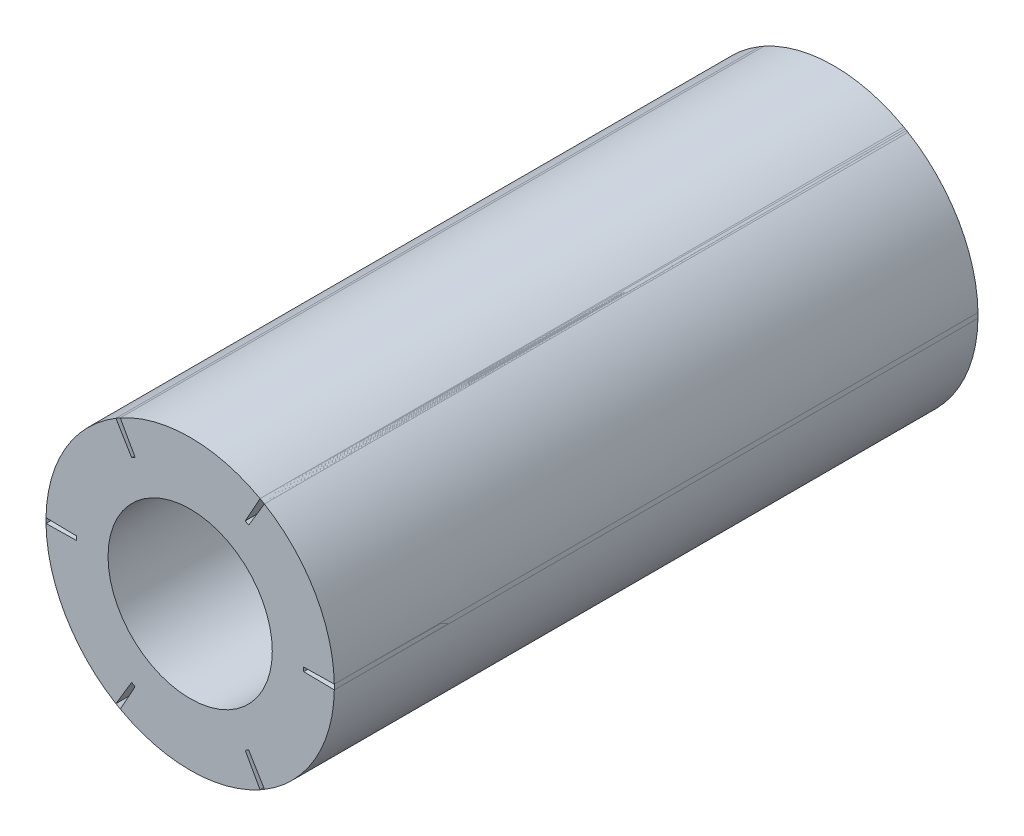
ISO-10303-21;
HEADER;
FILE_DESCRIPTION(('STEP AP214'),'2;1');
FILE_NAME('part.step','',(''),(''),'','','');
FILE_SCHEMA(('AUTOMOTIVE_DESIGN { 1 0 10303 214 1 1 1 1 }'));
ENDSEC;
DATA;
#1=APPLICATION_CONTEXT('core data for automotive mechanical design processes');
#2=APPLICATION_PROTOCOL_DEFINITION('international standard','automotive_design',2000,#1);
#3=PRODUCT_CONTEXT('',#1,'mechanical');
#4=PRODUCT('Part','Part','',(#3));
#5=PRODUCT_RELATED_PRODUCT_CATEGORY('part','',(#4));
#6=PRODUCT_DEFINITION_FORMATION('','',#4);
#7=PRODUCT_DEFINITION_CONTEXT('part definition',#1,'design');
#8=PRODUCT_DEFINITION('design','',#6,#7);
#9=PRODUCT_DEFINITION_SHAPE('','',#8);
#10=(LENGTH_UNIT() NAMED_UNIT(*) SI_UNIT(.MILLI.,.METRE.));
#11=(NAMED_UNIT(*) PLANE_ANGLE_UNIT() SI_UNIT($,.RADIAN.));
#12=(NAMED_UNIT(*) SI_UNIT($,.STERADIAN.) SOLID_ANGLE_UNIT());
#13=UNCERTAINTY_MEASURE_WITH_UNIT(LENGTH_MEASURE(1.E-05),#10,'distance_accuracy_value','');
#14=(GEOMETRIC_REPRESENTATION_CONTEXT(3) GLOBAL_UNCERTAINTY_ASSIGNED_CONTEXT((#13)) GLOBAL_UNIT_ASSIGNED_CONTEXT((#10,
#11,#12)) REPRESENTATION_CONTEXT('',''));
#15=CARTESIAN_POINT('',(0.,0.,0.));
#16=DIRECTION('',(0.,0.,1.));
#17=DIRECTION('',(1.,0.,0.));
#18=AXIS2_PLACEMENT_3D('',#15,#16,#17);
#19=CARTESIAN_POINT('',(0.,0.,25.));
#20=DIRECTION('',(0.,0.,-1.));
#21=DIRECTION('',(-1.,0.,0.));
#22=AXIS2_PLACEMENT_3D('',#19,#20,#21);
#23=CYLINDRICAL_SURFACE('',#22,5.6);
#24=DIRECTION('',(0.,0.,-1.));
#25=VECTOR('',#24,1.);
#26=CARTESIAN_POINT('',(-2.88421321949728,4.80013688393124,25.));
#27=LINE('',#26,#25);
#28=CARTESIAN_POINT('',(-2.88421321949731,4.80013688393122,0.));
#29=VERTEX_POINT('',#28);
#30=CARTESIAN_POINT('',(-2.88421321949731,4.80013688393122,25.));
#31=VERTEX_POINT('',#30);
#32=EDGE_CURVE('E292',#29,#31,#27,.F.);
#33=ORIENTED_EDGE('',*,*,#32,.F.);
#34=CARTESIAN_POINT('',(0.,0.,0.));
#35=DIRECTION('',(0.,0.,1.));
#36=DIRECTION('',(1.,0.,0.));
#37=AXIS2_PLACEMENT_3D('',#34,#35,#36);
#38=CIRCLE('',#37,5.6);
#39=CARTESIAN_POINT('',(-5.59914709287577,0.0977334760499665,0.));
#40=VERTEX_POINT('',#39);
#41=EDGE_CURVE('E239',#29,#40,#38,.T.);
#42=ORIENTED_EDGE('',*,*,#41,.T.);
#43=DIRECTION('',(0.,0.,-1.));
#44=VECTOR('',#43,1.);
#45=CARTESIAN_POINT('',(-5.59914709287577,0.0977334760499665,25.));
#46=LINE('',#45,#44);
#47=CARTESIAN_POINT('',(-5.59914709287577,0.0977334760499665,25.));
#48=VERTEX_POINT('',#47);
#49=EDGE_CURVE('E301',#40,#48,#46,.F.);
#50=ORIENTED_EDGE('',*,*,#49,.T.);
#51=CARTESIAN_POINT('',(0.,0.,25.));
#52=DIRECTION('',(0.,0.,1.));
#53=DIRECTION('',(1.,0.,0.));
#54=AXIS2_PLACEMENT_3D('',#51,#52,#53);
#55=CIRCLE('',#54,5.6);
#56=EDGE_CURVE('E232',#31,#48,#55,.T.);
#57=ORIENTED_EDGE('',*,*,#56,.F.);
#58=EDGE_LOOP('',(#33,#42,#50,#57));
#59=FACE_BOUND('',#58,.T.);
#60=ADVANCED_FACE('F46',(#59),#23,.T.);
#61=DIRECTION('',(0.,0.,-1.));
#62=VECTOR('',#61,1.);
#63=CARTESIAN_POINT('',(-5.59914709287577,-0.097733476049927,25.));
#64=LINE('',#63,#62);
#65=CARTESIAN_POINT('',(-5.59914709287577,-0.0977334760499665,0.));
#66=VERTEX_POINT('',#65);
#67=CARTESIAN_POINT('',(-5.59914709287577,-0.0977334760499665,25.));
#68=VERTEX_POINT('',#67);
#69=EDGE_CURVE('E296',#66,#68,#64,.F.);
#70=ORIENTED_EDGE('',*,*,#69,.F.);
#71=CARTESIAN_POINT('',(-2.88421321949732,-4.80013688393122,0.));
#72=VERTEX_POINT('',#71);
#73=EDGE_CURVE('E257',#66,#72,#38,.T.);
#74=ORIENTED_EDGE('',*,*,#73,.T.);
#75=DIRECTION('',(0.,0.,-1.));
#76=VECTOR('',#75,1.);
#77=CARTESIAN_POINT('',(-2.88421321949732,-4.80013688393122,25.));
#78=LINE('',#77,#76);
#79=CARTESIAN_POINT('',(-2.88421321949732,-4.80013688393122,25.));
#80=VERTEX_POINT('',#79);
#81=EDGE_CURVE('E261',#72,#80,#78,.F.);
#82=ORIENTED_EDGE('',*,*,#81,.T.);
#83=EDGE_CURVE('E268',#68,#80,#55,.T.);
#84=ORIENTED_EDGE('',*,*,#83,.F.);
#85=EDGE_LOOP('',(#70,#74,#82,#84));
#86=FACE_BOUND('',#85,.T.);
#87=ADVANCED_FACE('F557',(#86),#23,.T.);
#88=DIRECTION('',(0.,0.,-1.));
#89=VECTOR('',#88,1.);
#90=CARTESIAN_POINT('',(-2.71493387337848,-4.89787035998118,25.));
#91=LINE('',#90,#89);
#92=CARTESIAN_POINT('',(-2.71493387337846,-4.89787035998119,0.));
#93=VERTEX_POINT('',#92);
#94=CARTESIAN_POINT('',(-2.71493387337846,-4.89787035998119,25.));
#95=VERTEX_POINT('',#94);
#96=EDGE_CURVE('E311',#93,#95,#91,.F.);
#97=ORIENTED_EDGE('',*,*,#96,.F.);
#98=CARTESIAN_POINT('',(2.71493387337846,-4.89787035998119,0.));
#99=VERTEX_POINT('',#98);
#100=EDGE_CURVE('E259',#93,#99,#38,.T.);
#101=ORIENTED_EDGE('',*,*,#100,.T.);
#102=DIRECTION('',(0.,0.,-1.));
#103=VECTOR('',#102,1.);
#104=CARTESIAN_POINT('',(2.71493387337846,-4.89787035998119,25.));
#105=LINE('',#104,#103);
#106=CARTESIAN_POINT('',(2.71493387337846,-4.89787035998119,25.));
#107=VERTEX_POINT('',#106);
#108=EDGE_CURVE('E234',#99,#107,#105,.F.);
#109=ORIENTED_EDGE('',*,*,#108,.T.);
#110=EDGE_CURVE('E271',#95,#107,#55,.T.);
#111=ORIENTED_EDGE('',*,*,#110,.F.);
#112=EDGE_LOOP('',(#97,#101,#109,#111));
#113=FACE_BOUND('',#112,.T.);
#114=ADVANCED_FACE('F326',(#113),#23,.T.);
#115=DIRECTION('',(0.,0.,-1.));
#116=VECTOR('',#115,1.);
#117=CARTESIAN_POINT('',(2.88421321949738,-4.80013688393119,25.));
#118=LINE('',#117,#116);
#119=CARTESIAN_POINT('',(2.88421321949731,-4.80013688393122,0.));
#120=VERTEX_POINT('',#119);
#121=CARTESIAN_POINT('',(2.88421321949731,-4.80013688393122,25.));
#122=VERTEX_POINT('',#121);
#123=EDGE_CURVE('E147',#120,#122,#118,.F.);
#124=ORIENTED_EDGE('',*,*,#123,.F.);
#125=CARTESIAN_POINT('',(5.59914709287577,-0.0977334760499688,0.));
#126=VERTEX_POINT('',#125);
#127=EDGE_CURVE('E230',#120,#126,#38,.T.);
#128=ORIENTED_EDGE('',*,*,#127,.T.);
#129=DIRECTION('',(0.,0.,-1.));
#130=VECTOR('',#129,1.);
#131=CARTESIAN_POINT('',(5.59914709287577,-0.0977334760499688,25.));
#132=LINE('',#131,#130);
#133=CARTESIAN_POINT('',(5.59914709287577,-0.0977334760499688,25.));
#134=VERTEX_POINT('',#133);
#135=EDGE_CURVE('E459',#134,#126,#132,.T.);
#136=ORIENTED_EDGE('',*,*,#135,.F.);
#137=EDGE_CURVE('E274',#122,#134,#55,.T.);
#138=ORIENTED_EDGE('',*,*,#137,.F.);
#139=EDGE_LOOP('',(#124,#128,#136,#138));
#140=FACE_BOUND('',#139,.T.);
#141=ADVANCED_FACE('F458',(#140),#23,.T.);
#142=CARTESIAN_POINT('',(2.71493387337846,4.89787035998119,0.));
#143=VERTEX_POINT('',#142);
#144=CARTESIAN_POINT('',(-2.71493387337846,4.89787035998119,0.));
#145=VERTEX_POINT('',#144);
#146=EDGE_CURVE('E217',#143,#145,#38,.T.);
#147=ORIENTED_EDGE('',*,*,#146,.T.);
#148=DIRECTION('',(0.,0.,-1.));
#149=VECTOR('',#148,1.);
#150=CARTESIAN_POINT('',(-2.71493387337846,4.89787035998119,25.));
#151=LINE('',#150,#149);
#152=CARTESIAN_POINT('',(-2.71493387337846,4.89787035998119,25.));
#153=VERTEX_POINT('',#152);
#154=EDGE_CURVE('E229',#145,#153,#151,.F.);
#155=ORIENTED_EDGE('',*,*,#154,.T.);
#156=CARTESIAN_POINT('',(2.71493387337846,4.89787035998119,25.));
#157=VERTEX_POINT('',#156);
#158=EDGE_CURVE('E220',#157,#153,#55,.T.);
#159=ORIENTED_EDGE('',*,*,#158,.F.);
#160=DIRECTION('',(0.,0.,-1.));
#161=VECTOR('',#160,1.);
#162=CARTESIAN_POINT('',(2.71493387337834,4.89787035998125,25.));
#163=LINE('',#162,#161);
#164=EDGE_CURVE('E203',#143,#157,#163,.F.);
#165=ORIENTED_EDGE('',*,*,#164,.F.);
#166=EDGE_LOOP('',(#147,#155,#159,#165));
#167=FACE_BOUND('',#166,.T.);
#168=ADVANCED_FACE('F215',(#167),#23,.T.);
#169=CARTESIAN_POINT('',(0.,0.,25.));
#170=DIRECTION('',(0.,0.,1.));
#171=DIRECTION('',(1.,0.,0.));
#172=AXIS2_PLACEMENT_3D('',#169,#170,#171);
#173=PLANE('',#172);
#174=DIRECTION('',(0.860145247092158,0.510049168124771,0.));
#175=VECTOR('',#174,1.);
#176=CARTESIAN_POINT('',(-2.27131174979071,3.78009754319653,25.));
#177=LINE('',#176,#175);
#178=CARTESIAN_POINT('',(-2.27131174979071,3.78009754319653,25.));
#179=VERTEX_POINT('',#178);
#180=CARTESIAN_POINT('',(-2.13887386584799,3.85863059649369,25.));
#181=VERTEX_POINT('',#180);
#182=EDGE_CURVE('E56',#179,#181,#177,.T.);
#183=ORIENTED_EDGE('',*,*,#182,.F.);
#184=DIRECTION('',(0.515038074910234,-0.857167300702004,0.));
#185=VECTOR('',#184,1.);
#186=CARTESIAN_POINT('',(-2.88421321949731,4.80013688393122,25.));
#187=LINE('',#186,#185);
#188=EDGE_CURVE('E294',#31,#179,#187,.T.);
#189=ORIENTED_EDGE('',*,*,#188,.F.);
#190=ORIENTED_EDGE('',*,*,#56,.T.);
#191=DIRECTION('',(-0.999847695156387,0.0174524064374934,0.));
#192=VECTOR('',#191,1.);
#193=CARTESIAN_POINT('',(-5.59914709287577,0.0977334760499665,25.));
#194=LINE('',#193,#192);
#195=CARTESIAN_POINT('',(-4.41110905330743,0.0769961949318594,25.));
#196=VERTEX_POINT('',#195);
#197=EDGE_CURVE('E429',#196,#48,#194,.T.);
#198=ORIENTED_EDGE('',*,*,#197,.F.);
#199=DIRECTION('',(-0.0116429132290937,0.999932218988637,0.));
#200=VECTOR('',#199,1.);
#201=CARTESIAN_POINT('',(-4.40931637608669,-0.0769649036345756,25.));
#202=LINE('',#201,#200);
#203=CARTESIAN_POINT('',(-4.40931637608669,-0.0769649036345756,25.));
#204=VERTEX_POINT('',#203);
#205=EDGE_CURVE('E299',#204,#196,#202,.T.);
#206=ORIENTED_EDGE('',*,*,#205,.F.);
#207=DIRECTION('',(0.999847695156388,0.0174524064374934,0.));
#208=VECTOR('',#207,1.);
#209=CARTESIAN_POINT('',(-5.59914709287577,-0.0977334760499665,25.));
#210=LINE('',#209,#208);
#211=EDGE_CURVE('E300',#68,#204,#210,.T.);
#212=ORIENTED_EDGE('',*,*,#211,.F.);
#213=ORIENTED_EDGE('',*,*,#83,.T.);
#214=DIRECTION('',(-0.515038074910234,-0.857167300702004,0.));
#215=VECTOR('',#214,1.);
#216=CARTESIAN_POINT('',(-2.88421321949732,-4.80013688393122,25.));
#217=LINE('',#216,#215);
#218=CARTESIAN_POINT('',(-2.27223518745945,-3.78163440156183,25.));
#219=VERTEX_POINT('',#218);
#220=EDGE_CURVE('E346',#219,#80,#217,.T.);
#221=ORIENTED_EDGE('',*,*,#220,.F.);
#222=DIRECTION('',(-0.871788160321251,0.489883050863866,0.));
#223=VECTOR('',#222,1.);
#224=CARTESIAN_POINT('',(-2.13800462629598,-3.8570624468311,25.));
#225=LINE('',#224,#223);
#226=CARTESIAN_POINT('',(-2.13800462629598,-3.8570624468311,25.));
#227=VERTEX_POINT('',#226);
#228=EDGE_CURVE('E314',#227,#219,#225,.T.);
#229=ORIENTED_EDGE('',*,*,#228,.F.);
#230=DIRECTION('',(0.484809620246154,0.874619707139497,0.));
#231=VECTOR('',#230,1.);
#232=CARTESIAN_POINT('',(-2.71493387337846,-4.89787035998119,25.));
#233=LINE('',#232,#231);
#234=EDGE_CURVE('E315',#95,#227,#233,.T.);
#235=ORIENTED_EDGE('',*,*,#234,.F.);
#236=ORIENTED_EDGE('',*,*,#110,.T.);
#237=DIRECTION('',(0.484809620246153,-0.874619707139498,0.));
#238=VECTOR('',#237,1.);
#239=CARTESIAN_POINT('',(2.71493387337846,-4.89787035998119,25.));
#240=LINE('',#239,#238);
#241=CARTESIAN_POINT('',(2.13887386584799,-3.85863059649369,25.));
#242=VERTEX_POINT('',#241);
#243=EDGE_CURVE('E338',#242,#107,#240,.T.);
#244=ORIENTED_EDGE('',*,*,#243,.F.);
#245=DIRECTION('',(-0.860145247092158,-0.510049168124771,0.));
#246=VECTOR('',#245,1.);
#247=CARTESIAN_POINT('',(2.27131174979071,-3.78009754319653,25.));
#248=LINE('',#247,#246);
#249=CARTESIAN_POINT('',(2.27131174979071,-3.78009754319653,25.));
#250=VERTEX_POINT('',#249);
#251=EDGE_CURVE('E318',#250,#242,#248,.T.);
#252=ORIENTED_EDGE('',*,*,#251,.F.);
#253=DIRECTION('',(-0.515038074910234,0.857167300702004,0.));
#254=VECTOR('',#253,1.);
#255=CARTESIAN_POINT('',(2.88421321949731,-4.80013688393122,25.));
#256=LINE('',#255,#254);
#257=EDGE_CURVE('E319',#122,#250,#256,.T.);
#258=ORIENTED_EDGE('',*,*,#257,.F.);
#259=ORIENTED_EDGE('',*,*,#137,.T.);
#260=DIRECTION('',(-0.999847695156388,0.0174524064374935,0.));
#261=VECTOR('',#260,1.);
#262=CARTESIAN_POINT('',(5.59914709287577,-0.0977334760499688,25.));
#263=LINE('',#262,#261);
#264=CARTESIAN_POINT('',(4.41110905330743,-0.0769961949318616,25.));
#265=VERTEX_POINT('',#264);
#266=EDGE_CURVE('E276',#134,#265,#263,.T.);
#267=ORIENTED_EDGE('',*,*,#266,.T.);
#268=DIRECTION('',(0.0116429132290993,-0.999932218988637,0.));
#269=VECTOR('',#268,1.);
#270=CARTESIAN_POINT('',(4.40931637608669,0.0769649036345737,25.));
#271=LINE('',#270,#269);
#272=CARTESIAN_POINT('',(4.40931637608669,0.0769649036345737,25.));
#273=VERTEX_POINT('',#272);
#274=EDGE_CURVE('E466',#273,#265,#271,.T.);
#275=ORIENTED_EDGE('',*,*,#274,.F.);
#276=DIRECTION('',(-0.999847695156387,-0.0174524064374929,0.));
#277=VECTOR('',#276,1.);
#278=CARTESIAN_POINT('',(5.59914709287577,0.097733476049964,25.));
#279=LINE('',#278,#277);
#280=CARTESIAN_POINT('',(5.59914709287577,0.097733476049964,25.));
#281=VERTEX_POINT('',#280);
#282=EDGE_CURVE('E528',#281,#273,#279,.T.);
#283=ORIENTED_EDGE('',*,*,#282,.F.);
#284=CARTESIAN_POINT('',(2.88421321949732,4.80013688393122,25.));
#285=VERTEX_POINT('',#284);
#286=EDGE_CURVE('E265',#281,#285,#55,.T.);
#287=ORIENTED_EDGE('',*,*,#286,.T.);
#288=DIRECTION('',(0.515038074910234,0.857167300702004,0.));
#289=VECTOR('',#288,1.);
#290=CARTESIAN_POINT('',(2.88421321949732,4.80013688393122,25.));
#291=LINE('',#290,#289);
#292=CARTESIAN_POINT('',(2.27223518745945,3.78163440156183,25.));
#293=VERTEX_POINT('',#292);
#294=EDGE_CURVE('E369',#293,#285,#291,.T.);
#295=ORIENTED_EDGE('',*,*,#294,.F.);
#296=DIRECTION('',(0.871788160321251,-0.489883050863866,0.));
#297=VECTOR('',#296,1.);
#298=CARTESIAN_POINT('',(2.13800462629598,3.8570624468311,25.));
#299=LINE('',#298,#297);
#300=CARTESIAN_POINT('',(2.13800462629598,3.8570624468311,25.));
#301=VERTEX_POINT('',#300);
#302=EDGE_CURVE('E222',#301,#293,#299,.T.);
#303=ORIENTED_EDGE('',*,*,#302,.F.);
#304=DIRECTION('',(-0.484809620246154,-0.874619707139497,0.));
#305=VECTOR('',#304,1.);
#306=CARTESIAN_POINT('',(2.71493387337846,4.89787035998119,25.));
#307=LINE('',#306,#305);
#308=EDGE_CURVE('E223',#157,#301,#307,.T.);
#309=ORIENTED_EDGE('',*,*,#308,.F.);
#310=ORIENTED_EDGE('',*,*,#158,.T.);
#311=DIRECTION('',(-0.484809620246154,0.874619707139498,0.));
#312=VECTOR('',#311,1.);
#313=CARTESIAN_POINT('',(-2.71493387337846,4.89787035998119,25.));
#314=LINE('',#313,#312);
#315=EDGE_CURVE('E423',#181,#153,#314,.T.);
#316=ORIENTED_EDGE('',*,*,#315,.F.);
#317=EDGE_LOOP('',(#183,#189,#190,#198,#206,#212,#213,#221,#229,#235,#236,#244,#252,#258,#259,
#267,#275,#283,#287,#295,#303,#309,#310,#316));
#318=FACE_BOUND('',#317,.T.);
#319=CARTESIAN_POINT('',(0.,0.,25.));
#320=DIRECTION('',(0.,0.,1.));
#321=DIRECTION('',(1.,0.,0.));
#322=AXIS2_PLACEMENT_3D('',#319,#320,#321);
#323=CIRCLE('',#322,3.19);
#324=CARTESIAN_POINT('',(3.19,0.,25.));
#325=VERTEX_POINT('',#324);
#326=EDGE_CURVE('E472',#325,#325,#323,.T.);
#327=ORIENTED_EDGE('',*,*,#326,.F.);
#328=EDGE_LOOP('',(#327));
#329=FACE_BOUND('',#328,.T.);
#330=ADVANCED_FACE('F335',(#318,#329),#173,.T.);
#331=CARTESIAN_POINT('',(0.,0.,0.));
#332=DIRECTION('',(0.,0.,1.));
#333=DIRECTION('',(1.,0.,0.));
#334=AXIS2_PLACEMENT_3D('',#331,#332,#333);
#335=PLANE('',#334);
#336=CARTESIAN_POINT('',(0.,0.,0.));
#337=DIRECTION('',(0.,0.,1.));
#338=DIRECTION('',(1.,0.,0.));
#339=AXIS2_PLACEMENT_3D('',#336,#337,#338);
#340=CIRCLE('',#339,3.19);
#341=CARTESIAN_POINT('',(3.19,0.,0.));
#342=VERTEX_POINT('',#341);
#343=EDGE_CURVE('E264',#342,#342,#340,.T.);
#344=ORIENTED_EDGE('',*,*,#343,.T.);
#345=EDGE_LOOP('',(#344));
#346=FACE_BOUND('',#345,.T.);
#347=DIRECTION('',(0.515038074910234,-0.857167300702004,0.));
#348=VECTOR('',#347,1.);
#349=CARTESIAN_POINT('',(-2.88421321949731,4.80013688393122,0.));
#350=LINE('',#349,#348);
#351=CARTESIAN_POINT('',(-2.27131174979071,3.78009754319653,0.));
#352=VERTEX_POINT('',#351);
#353=EDGE_CURVE('E374',#29,#352,#350,.T.);
#354=ORIENTED_EDGE('',*,*,#353,.T.);
#355=DIRECTION('',(0.860145247092158,0.510049168124771,0.));
#356=VECTOR('',#355,1.);
#357=CARTESIAN_POINT('',(-2.27131174979071,3.78009754319653,0.));
#358=LINE('',#357,#356);
#359=CARTESIAN_POINT('',(-2.13887386584799,3.85863059649369,0.));
#360=VERTEX_POINT('',#359);
#361=EDGE_CURVE('E376',#352,#360,#358,.T.);
#362=ORIENTED_EDGE('',*,*,#361,.T.);
#363=DIRECTION('',(-0.484809620246154,0.874619707139498,0.));
#364=VECTOR('',#363,1.);
#365=CARTESIAN_POINT('',(-2.71493387337846,4.89787035998119,0.));
#366=LINE('',#365,#364);
#367=EDGE_CURVE('E211',#360,#145,#366,.T.);
#368=ORIENTED_EDGE('',*,*,#367,.T.);
#369=ORIENTED_EDGE('',*,*,#146,.F.);
#370=DIRECTION('',(-0.484809620246154,-0.874619707139497,0.));
#371=VECTOR('',#370,1.);
#372=CARTESIAN_POINT('',(2.71493387337846,4.89787035998119,0.));
#373=LINE('',#372,#371);
#374=CARTESIAN_POINT('',(2.13800462629598,3.8570624468311,0.));
#375=VERTEX_POINT('',#374);
#376=EDGE_CURVE('E199',#143,#375,#373,.T.);
#377=ORIENTED_EDGE('',*,*,#376,.T.);
#378=DIRECTION('',(0.871788160321251,-0.489883050863866,0.));
#379=VECTOR('',#378,1.);
#380=CARTESIAN_POINT('',(2.13800462629598,3.8570624468311,0.));
#381=LINE('',#380,#379);
#382=CARTESIAN_POINT('',(2.27223518745945,3.78163440156183,0.));
#383=VERTEX_POINT('',#382);
#384=EDGE_CURVE('E210',#375,#383,#381,.T.);
#385=ORIENTED_EDGE('',*,*,#384,.T.);
#386=DIRECTION('',(0.515038074910234,0.857167300702004,0.));
#387=VECTOR('',#386,1.);
#388=CARTESIAN_POINT('',(2.88421321949732,4.80013688393122,0.));
#389=LINE('',#388,#387);
#390=CARTESIAN_POINT('',(2.88421321949732,4.80013688393122,0.));
#391=VERTEX_POINT('',#390);
#392=EDGE_CURVE('E413',#383,#391,#389,.T.);
#393=ORIENTED_EDGE('',*,*,#392,.T.);
#394=CARTESIAN_POINT('',(5.59914709287577,0.097733476049964,0.));
#395=VERTEX_POINT('',#394);
#396=EDGE_CURVE('E252',#395,#391,#38,.T.);
#397=ORIENTED_EDGE('',*,*,#396,.F.);
#398=DIRECTION('',(-0.999847695156387,-0.0174524064374929,0.));
#399=VECTOR('',#398,1.);
#400=CARTESIAN_POINT('',(5.59914709287577,0.097733476049964,0.));
#401=LINE('',#400,#399);
#402=CARTESIAN_POINT('',(4.40931637608669,0.0769649036345737,0.));
#403=VERTEX_POINT('',#402);
#404=EDGE_CURVE('E416',#395,#403,#401,.T.);
#405=ORIENTED_EDGE('',*,*,#404,.T.);
#406=DIRECTION('',(0.0116429132290993,-0.999932218988637,0.));
#407=VECTOR('',#406,1.);
#408=CARTESIAN_POINT('',(4.40931637608669,0.0769649036345737,0.));
#409=LINE('',#408,#407);
#410=CARTESIAN_POINT('',(4.41110905330743,-0.0769961949318616,0.));
#411=VERTEX_POINT('',#410);
#412=EDGE_CURVE('E241',#403,#411,#409,.T.);
#413=ORIENTED_EDGE('',*,*,#412,.T.);
#414=DIRECTION('',(-0.999847695156388,0.0174524064374935,0.));
#415=VECTOR('',#414,1.);
#416=CARTESIAN_POINT('',(5.59914709287577,-0.0977334760499688,0.));
#417=LINE('',#416,#415);
#418=EDGE_CURVE('E454',#126,#411,#417,.T.);
#419=ORIENTED_EDGE('',*,*,#418,.F.);
#420=ORIENTED_EDGE('',*,*,#127,.F.);
#421=DIRECTION('',(-0.515038074910234,0.857167300702004,0.));
#422=VECTOR('',#421,1.);
#423=CARTESIAN_POINT('',(2.88421321949731,-4.80013688393122,0.));
#424=LINE('',#423,#422);
#425=CARTESIAN_POINT('',(2.27131174979071,-3.78009754319653,0.));
#426=VERTEX_POINT('',#425);
#427=EDGE_CURVE('E143',#120,#426,#424,.T.);
#428=ORIENTED_EDGE('',*,*,#427,.T.);
#429=DIRECTION('',(-0.860145247092158,-0.510049168124771,0.));
#430=VECTOR('',#429,1.);
#431=CARTESIAN_POINT('',(2.27131174979071,-3.78009754319653,0.));
#432=LINE('',#431,#430);
#433=CARTESIAN_POINT('',(2.13887386584799,-3.85863059649369,0.));
#434=VERTEX_POINT('',#433);
#435=EDGE_CURVE('E50',#426,#434,#432,.T.);
#436=ORIENTED_EDGE('',*,*,#435,.T.);
#437=DIRECTION('',(0.484809620246153,-0.874619707139498,0.));
#438=VECTOR('',#437,1.);
#439=CARTESIAN_POINT('',(2.71493387337846,-4.89787035998119,0.));
#440=LINE('',#439,#438);
#441=EDGE_CURVE('E398',#434,#99,#440,.T.);
#442=ORIENTED_EDGE('',*,*,#441,.T.);
#443=ORIENTED_EDGE('',*,*,#100,.F.);
#444=DIRECTION('',(0.484809620246154,0.874619707139497,0.));
#445=VECTOR('',#444,1.);
#446=CARTESIAN_POINT('',(-2.71493387337846,-4.89787035998119,0.));
#447=LINE('',#446,#445);
#448=CARTESIAN_POINT('',(-2.13800462629598,-3.8570624468311,0.));
#449=VERTEX_POINT('',#448);
#450=EDGE_CURVE('E394',#93,#449,#447,.T.);
#451=ORIENTED_EDGE('',*,*,#450,.T.);
#452=DIRECTION('',(-0.871788160321251,0.489883050863866,0.));
#453=VECTOR('',#452,1.);
#454=CARTESIAN_POINT('',(-2.13800462629598,-3.8570624468311,0.));
#455=LINE('',#454,#453);
#456=CARTESIAN_POINT('',(-2.27223518745945,-3.78163440156183,0.));
#457=VERTEX_POINT('',#456);
#458=EDGE_CURVE('E397',#449,#457,#455,.T.);
#459=ORIENTED_EDGE('',*,*,#458,.T.);
#460=DIRECTION('',(-0.515038074910234,-0.857167300702004,0.));
#461=VECTOR('',#460,1.);
#462=CARTESIAN_POINT('',(-2.88421321949732,-4.80013688393122,0.));
#463=LINE('',#462,#461);
#464=EDGE_CURVE('E386',#457,#72,#463,.T.);
#465=ORIENTED_EDGE('',*,*,#464,.T.);
#466=ORIENTED_EDGE('',*,*,#73,.F.);
#467=DIRECTION('',(0.999847695156388,0.0174524064374934,0.));
#468=VECTOR('',#467,1.);
#469=CARTESIAN_POINT('',(-5.59914709287577,-0.0977334760499665,0.));
#470=LINE('',#469,#468);
#471=CARTESIAN_POINT('',(-4.40931637608669,-0.0769649036345756,0.));
#472=VERTEX_POINT('',#471);
#473=EDGE_CURVE('E382',#66,#472,#470,.T.);
#474=ORIENTED_EDGE('',*,*,#473,.T.);
#475=DIRECTION('',(-0.0116429132290937,0.999932218988637,0.));
#476=VECTOR('',#475,1.);
#477=CARTESIAN_POINT('',(-4.40931637608669,-0.0769649036345756,0.));
#478=LINE('',#477,#476);
#479=CARTESIAN_POINT('',(-4.41110905330743,0.0769961949318594,0.));
#480=VERTEX_POINT('',#479);
#481=EDGE_CURVE('E385',#472,#480,#478,.T.);
#482=ORIENTED_EDGE('',*,*,#481,.T.);
#483=DIRECTION('',(-0.999847695156387,0.0174524064374934,0.));
#484=VECTOR('',#483,1.);
#485=CARTESIAN_POINT('',(-5.59914709287577,0.0977334760499665,0.));
#486=LINE('',#485,#484);
#487=EDGE_CURVE('E389',#480,#40,#486,.T.);
#488=ORIENTED_EDGE('',*,*,#487,.T.);
#489=ORIENTED_EDGE('',*,*,#41,.F.);
#490=EDGE_LOOP('',(#354,#362,#368,#369,#377,#385,#393,#397,#405,#413,#419,#420,#428,#436,#442,
#443,#451,#459,#465,#466,#474,#482,#488,#489));
#491=FACE_BOUND('',#490,.T.);
#492=ADVANCED_FACE('F226',(#346,#491),#335,.F.);
#493=ORIENTED_EDGE('',*,*,#396,.T.);
#494=DIRECTION('',(0.,0.,-1.));
#495=VECTOR('',#494,1.);
#496=CARTESIAN_POINT('',(2.88421321949732,4.80013688393122,25.));
#497=LINE('',#496,#495);
#498=EDGE_CURVE('E282',#391,#285,#497,.F.);
#499=ORIENTED_EDGE('',*,*,#498,.T.);
#500=ORIENTED_EDGE('',*,*,#286,.F.);
#501=DIRECTION('',(0.,0.,-1.));
#502=VECTOR('',#501,1.);
#503=CARTESIAN_POINT('',(5.59914709287577,0.097733476049964,25.));
#504=LINE('',#503,#502);
#505=EDGE_CURVE('E285',#281,#395,#504,.T.);
#506=ORIENTED_EDGE('',*,*,#505,.T.);
#507=EDGE_LOOP('',(#493,#499,#500,#506));
#508=FACE_BOUND('',#507,.T.);
#509=ADVANCED_FACE('F48',(#508),#23,.T.);
#510=CARTESIAN_POINT('',(0.,0.,0.));
#511=DIRECTION('',(0.,0.,1.));
#512=DIRECTION('',(1.,0.,0.));
#513=AXIS2_PLACEMENT_3D('',#510,#511,#512);
#514=CYLINDRICAL_SURFACE('',#513,3.19);
#515=ORIENTED_EDGE('',*,*,#343,.F.);
#516=EDGE_LOOP('',(#515));
#517=FACE_BOUND('',#516,.T.);
#518=ORIENTED_EDGE('',*,*,#326,.T.);
#519=EDGE_LOOP('',(#518));
#520=FACE_BOUND('',#519,.T.);
#521=ADVANCED_FACE('F546',(#517,#520),#514,.F.);
#522=CARTESIAN_POINT('',(5.59914709287577,0.097733476049964,0.));
#523=DIRECTION('',(-0.0174524064374929,0.999847695156387,0.));
#524=DIRECTION('',(-0.999847695156388,-0.0174524064374929,0.));
#525=AXIS2_PLACEMENT_3D('',#522,#523,#524);
#526=PLANE('',#525);
#527=ORIENTED_EDGE('',*,*,#282,.T.);
#528=DIRECTION('',(0.,0.,1.));
#529=VECTOR('',#528,1.);
#530=CARTESIAN_POINT('',(4.40931637608669,0.0769649036345737,0.));
#531=LINE('',#530,#529);
#532=EDGE_CURVE('E463',#403,#273,#531,.T.);
#533=ORIENTED_EDGE('',*,*,#532,.F.);
#534=ORIENTED_EDGE('',*,*,#404,.F.);
#535=ORIENTED_EDGE('',*,*,#505,.F.);
#536=EDGE_LOOP('',(#527,#533,#534,#535));
#537=FACE_BOUND('',#536,.T.);
#538=ADVANCED_FACE('F526',(#537),#526,.F.);
#539=CARTESIAN_POINT('',(4.40931637608669,0.0769649036345737,0.));
#540=DIRECTION('',(-0.999932218988637,-0.0116429132290993,0.));
#541=DIRECTION('',(0.0116429132290993,-0.999932218988637,0.));
#542=AXIS2_PLACEMENT_3D('',#539,#540,#541);
#543=PLANE('',#542);
#544=ORIENTED_EDGE('',*,*,#274,.T.);
#545=DIRECTION('',(0.,0.,1.));
#546=VECTOR('',#545,1.);
#547=CARTESIAN_POINT('',(4.41110905330743,-0.0769961949318616,0.));
#548=LINE('',#547,#546);
#549=EDGE_CURVE('E371',#411,#265,#548,.T.);
#550=ORIENTED_EDGE('',*,*,#549,.F.);
#551=ORIENTED_EDGE('',*,*,#412,.F.);
#552=ORIENTED_EDGE('',*,*,#532,.T.);
#553=EDGE_LOOP('',(#544,#550,#551,#552));
#554=FACE_BOUND('',#553,.T.);
#555=ADVANCED_FACE('F570',(#554),#543,.F.);
#556=CARTESIAN_POINT('',(5.59914709287577,-0.0977334760499688,0.));
#557=DIRECTION('',(0.0174524064374935,0.999847695156388,0.));
#558=DIRECTION('',(-0.999847695156388,0.0174524064374935,0.));
#559=AXIS2_PLACEMENT_3D('',#556,#557,#558);
#560=PLANE('',#559);
#561=ORIENTED_EDGE('',*,*,#266,.F.);
#562=ORIENTED_EDGE('',*,*,#135,.T.);
#563=ORIENTED_EDGE('',*,*,#418,.T.);
#564=ORIENTED_EDGE('',*,*,#549,.T.);
#565=EDGE_LOOP('',(#561,#562,#563,#564));
#566=FACE_BOUND('',#565,.T.);
#567=ADVANCED_FACE('F461',(#566),#560,.T.);
#568=CARTESIAN_POINT('',(2.88421321949732,4.80013688393122,0.));
#569=DIRECTION('',(0.857167300702004,-0.515038074910234,0.));
#570=DIRECTION('',(0.515038074910234,0.857167300702004,0.));
#571=AXIS2_PLACEMENT_3D('',#568,#569,#570);
#572=PLANE('',#571);
#573=ORIENTED_EDGE('',*,*,#294,.T.);
#574=ORIENTED_EDGE('',*,*,#498,.F.);
#575=ORIENTED_EDGE('',*,*,#392,.F.);
#576=DIRECTION('',(0.,0.,1.));
#577=VECTOR('',#576,1.);
#578=CARTESIAN_POINT('',(2.27223518745945,3.78163440156183,0.));
#579=LINE('',#578,#577);
#580=EDGE_CURVE('E366',#383,#293,#579,.T.);
#581=ORIENTED_EDGE('',*,*,#580,.T.);
#582=EDGE_LOOP('',(#573,#574,#575,#581));
#583=FACE_BOUND('',#582,.T.);
#584=ADVANCED_FACE('F520',(#583),#572,.F.);
#585=CARTESIAN_POINT('',(2.71493387337846,4.89787035998119,0.));
#586=DIRECTION('',(-0.874619707139497,0.484809620246154,0.));
#587=DIRECTION('',(-0.484809620246154,-0.874619707139497,0.));
#588=AXIS2_PLACEMENT_3D('',#585,#586,#587);
#589=PLANE('',#588);
#590=ORIENTED_EDGE('',*,*,#308,.T.);
#591=DIRECTION('',(0.,0.,1.));
#592=VECTOR('',#591,1.);
#593=CARTESIAN_POINT('',(2.13800462629598,3.8570624468311,0.));
#594=LINE('',#593,#592);
#595=EDGE_CURVE('E205',#375,#301,#594,.T.);
#596=ORIENTED_EDGE('',*,*,#595,.F.);
#597=ORIENTED_EDGE('',*,*,#376,.F.);
#598=ORIENTED_EDGE('',*,*,#164,.T.);
#599=EDGE_LOOP('',(#590,#596,#597,#598));
#600=FACE_BOUND('',#599,.T.);
#601=ADVANCED_FACE('F202',(#600),#589,.F.);
#602=CARTESIAN_POINT('',(2.13800462629598,3.8570624468311,0.));
#603=DIRECTION('',(-0.489883050863866,-0.871788160321251,0.));
#604=DIRECTION('',(0.871788160321251,-0.489883050863866,0.));
#605=AXIS2_PLACEMENT_3D('',#602,#603,#604);
#606=PLANE('',#605);
#607=ORIENTED_EDGE('',*,*,#302,.T.);
#608=ORIENTED_EDGE('',*,*,#580,.F.);
#609=ORIENTED_EDGE('',*,*,#384,.F.);
#610=ORIENTED_EDGE('',*,*,#595,.T.);
#611=EDGE_LOOP('',(#607,#608,#609,#610));
#612=FACE_BOUND('',#611,.T.);
#613=ADVANCED_FACE('F514',(#612),#606,.F.);
#614=CARTESIAN_POINT('',(2.71493387337846,-4.89787035998119,0.));
#615=DIRECTION('',(-0.874619707139498,-0.484809620246153,0.));
#616=DIRECTION('',(0.484809620246153,-0.874619707139498,0.));
#617=AXIS2_PLACEMENT_3D('',#614,#615,#616);
#618=PLANE('',#617);
#619=ORIENTED_EDGE('',*,*,#243,.T.);
#620=ORIENTED_EDGE('',*,*,#108,.F.);
#621=ORIENTED_EDGE('',*,*,#441,.F.);
#622=DIRECTION('',(0.,0.,1.));
#623=VECTOR('',#622,1.);
#624=CARTESIAN_POINT('',(2.13887386584799,-3.85863059649369,0.));
#625=LINE('',#624,#623);
#626=EDGE_CURVE('E359',#434,#242,#625,.T.);
#627=ORIENTED_EDGE('',*,*,#626,.T.);
#628=EDGE_LOOP('',(#619,#620,#621,#627));
#629=FACE_BOUND('',#628,.T.);
#630=ADVANCED_FACE('F618',(#629),#618,.F.);
#631=CARTESIAN_POINT('',(2.88421321949731,-4.80013688393122,0.));
#632=DIRECTION('',(0.857167300702004,0.515038074910234,0.));
#633=DIRECTION('',(-0.515038074910234,0.857167300702004,0.));
#634=AXIS2_PLACEMENT_3D('',#631,#632,#633);
#635=PLANE('',#634);
#636=ORIENTED_EDGE('',*,*,#257,.T.);
#637=DIRECTION('',(0.,0.,1.));
#638=VECTOR('',#637,1.);
#639=CARTESIAN_POINT('',(2.27131174979071,-3.78009754319653,0.));
#640=LINE('',#639,#638);
#641=EDGE_CURVE('E355',#426,#250,#640,.T.);
#642=ORIENTED_EDGE('',*,*,#641,.F.);
#643=ORIENTED_EDGE('',*,*,#427,.F.);
#644=ORIENTED_EDGE('',*,*,#123,.T.);
#645=EDGE_LOOP('',(#636,#642,#643,#644));
#646=FACE_BOUND('',#645,.T.);
#647=ADVANCED_FACE('F449',(#646),#635,.F.);
#648=CARTESIAN_POINT('',(2.27131174979071,-3.78009754319653,0.));
#649=DIRECTION('',(-0.510049168124771,0.860145247092158,0.));
#650=DIRECTION('',(-0.860145247092158,-0.510049168124771,0.));
#651=AXIS2_PLACEMENT_3D('',#648,#649,#650);
#652=PLANE('',#651);
#653=ORIENTED_EDGE('',*,*,#251,.T.);
#654=ORIENTED_EDGE('',*,*,#626,.F.);
#655=ORIENTED_EDGE('',*,*,#435,.F.);
#656=ORIENTED_EDGE('',*,*,#641,.T.);
#657=EDGE_LOOP('',(#653,#654,#655,#656));
#658=FACE_BOUND('',#657,.T.);
#659=ADVANCED_FACE('F444',(#658),#652,.F.);
#660=CARTESIAN_POINT('',(-2.88421321949732,-4.80013688393122,0.));
#661=DIRECTION('',(-0.857167300702004,0.515038074910234,0.));
#662=DIRECTION('',(-0.515038074910234,-0.857167300702004,0.));
#663=AXIS2_PLACEMENT_3D('',#660,#661,#662);
#664=PLANE('',#663);
#665=ORIENTED_EDGE('',*,*,#220,.T.);
#666=ORIENTED_EDGE('',*,*,#81,.F.);
#667=ORIENTED_EDGE('',*,*,#464,.F.);
#668=DIRECTION('',(0.,0.,1.));
#669=VECTOR('',#668,1.);
#670=CARTESIAN_POINT('',(-2.27223518745945,-3.78163440156183,0.));
#671=LINE('',#670,#669);
#672=EDGE_CURVE('E344',#457,#219,#671,.T.);
#673=ORIENTED_EDGE('',*,*,#672,.T.);
#674=EDGE_LOOP('',(#665,#666,#667,#673));
#675=FACE_BOUND('',#674,.T.);
#676=ADVANCED_FACE('F610',(#675),#664,.F.);
#677=CARTESIAN_POINT('',(-2.71493387337846,-4.89787035998119,0.));
#678=DIRECTION('',(0.874619707139497,-0.484809620246154,0.));
#679=DIRECTION('',(0.484809620246154,0.874619707139497,0.));
#680=AXIS2_PLACEMENT_3D('',#677,#678,#679);
#681=PLANE('',#680);
#682=ORIENTED_EDGE('',*,*,#234,.T.);
#683=DIRECTION('',(0.,0.,1.));
#684=VECTOR('',#683,1.);
#685=CARTESIAN_POINT('',(-2.13800462629598,-3.8570624468311,0.));
#686=LINE('',#685,#684);
#687=EDGE_CURVE('E436',#449,#227,#686,.T.);
#688=ORIENTED_EDGE('',*,*,#687,.F.);
#689=ORIENTED_EDGE('',*,*,#450,.F.);
#690=ORIENTED_EDGE('',*,*,#96,.T.);
#691=EDGE_LOOP('',(#682,#688,#689,#690));
#692=FACE_BOUND('',#691,.T.);
#693=ADVANCED_FACE('F608',(#692),#681,.F.);
#694=CARTESIAN_POINT('',(-2.13800462629598,-3.8570624468311,0.));
#695=DIRECTION('',(0.489883050863866,0.871788160321251,0.));
#696=DIRECTION('',(-0.871788160321251,0.489883050863866,0.));
#697=AXIS2_PLACEMENT_3D('',#694,#695,#696);
#698=PLANE('',#697);
#699=ORIENTED_EDGE('',*,*,#228,.T.);
#700=ORIENTED_EDGE('',*,*,#672,.F.);
#701=ORIENTED_EDGE('',*,*,#458,.F.);
#702=ORIENTED_EDGE('',*,*,#687,.T.);
#703=EDGE_LOOP('',(#699,#700,#701,#702));
#704=FACE_BOUND('',#703,.T.);
#705=ADVANCED_FACE('F602',(#704),#698,.F.);
#706=CARTESIAN_POINT('',(-5.59914709287577,0.0977334760499665,0.));
#707=DIRECTION('',(0.0174524064374934,0.999847695156387,0.));
#708=DIRECTION('',(-0.999847695156388,0.0174524064374934,0.));
#709=AXIS2_PLACEMENT_3D('',#706,#707,#708);
#710=PLANE('',#709);
#711=ORIENTED_EDGE('',*,*,#197,.T.);
#712=ORIENTED_EDGE('',*,*,#49,.F.);
#713=ORIENTED_EDGE('',*,*,#487,.F.);
#714=DIRECTION('',(0.,0.,1.));
#715=VECTOR('',#714,1.);
#716=CARTESIAN_POINT('',(-4.41110905330743,0.0769961949318594,0.));
#717=LINE('',#716,#715);
#718=EDGE_CURVE('E427',#480,#196,#717,.T.);
#719=ORIENTED_EDGE('',*,*,#718,.T.);
#720=EDGE_LOOP('',(#711,#712,#713,#719));
#721=FACE_BOUND('',#720,.T.);
#722=ADVANCED_FACE('F489',(#721),#710,.F.);
#723=CARTESIAN_POINT('',(-5.59914709287577,-0.0977334760499665,0.));
#724=DIRECTION('',(0.0174524064374934,-0.999847695156388,0.));
#725=DIRECTION('',(0.999847695156388,0.0174524064374934,0.));
#726=AXIS2_PLACEMENT_3D('',#723,#724,#725);
#727=PLANE('',#726);
#728=ORIENTED_EDGE('',*,*,#211,.T.);
#729=DIRECTION('',(0.,0.,1.));
#730=VECTOR('',#729,1.);
#731=CARTESIAN_POINT('',(-4.40931637608669,-0.0769649036345756,0.));
#732=LINE('',#731,#730);
#733=EDGE_CURVE('E430',#472,#204,#732,.T.);
#734=ORIENTED_EDGE('',*,*,#733,.F.);
#735=ORIENTED_EDGE('',*,*,#473,.F.);
#736=ORIENTED_EDGE('',*,*,#69,.T.);
#737=EDGE_LOOP('',(#728,#734,#735,#736));
#738=FACE_BOUND('',#737,.T.);
#739=ADVANCED_FACE('F598',(#738),#727,.F.);
#740=CARTESIAN_POINT('',(-4.40931637608669,-0.0769649036345756,0.));
#741=DIRECTION('',(0.999932218988637,0.0116429132290937,0.));
#742=DIRECTION('',(-0.0116429132290937,0.999932218988637,0.));
#743=AXIS2_PLACEMENT_3D('',#740,#741,#742);
#744=PLANE('',#743);
#745=ORIENTED_EDGE('',*,*,#205,.T.);
#746=ORIENTED_EDGE('',*,*,#718,.F.);
#747=ORIENTED_EDGE('',*,*,#481,.F.);
#748=ORIENTED_EDGE('',*,*,#733,.T.);
#749=EDGE_LOOP('',(#745,#746,#747,#748));
#750=FACE_BOUND('',#749,.T.);
#751=ADVANCED_FACE('F593',(#750),#744,.F.);
#752=CARTESIAN_POINT('',(-2.71493387337846,4.89787035998119,0.));
#753=DIRECTION('',(0.874619707139497,0.484809620246154,0.));
#754=DIRECTION('',(-0.484809620246154,0.874619707139497,0.));
#755=AXIS2_PLACEMENT_3D('',#752,#753,#754);
#756=PLANE('',#755);
#757=ORIENTED_EDGE('',*,*,#315,.T.);
#758=ORIENTED_EDGE('',*,*,#154,.F.);
#759=ORIENTED_EDGE('',*,*,#367,.F.);
#760=DIRECTION('',(0.,0.,1.));
#761=VECTOR('',#760,1.);
#762=CARTESIAN_POINT('',(-2.13887386584799,3.85863059649369,0.));
#763=LINE('',#762,#761);
#764=EDGE_CURVE('E422',#360,#181,#763,.T.);
#765=ORIENTED_EDGE('',*,*,#764,.T.);
#766=EDGE_LOOP('',(#757,#758,#759,#765));
#767=FACE_BOUND('',#766,.T.);
#768=ADVANCED_FACE('F508',(#767),#756,.F.);
#769=CARTESIAN_POINT('',(-2.88421321949731,4.80013688393122,0.));
#770=DIRECTION('',(-0.857167300702004,-0.515038074910234,0.));
#771=DIRECTION('',(0.515038074910234,-0.857167300702004,0.));
#772=AXIS2_PLACEMENT_3D('',#769,#770,#771);
#773=PLANE('',#772);
#774=ORIENTED_EDGE('',*,*,#188,.T.);
#775=DIRECTION('',(0.,0.,1.));
#776=VECTOR('',#775,1.);
#777=CARTESIAN_POINT('',(-2.27131174979071,3.78009754319653,0.));
#778=LINE('',#777,#776);
#779=EDGE_CURVE('E12',#352,#179,#778,.T.);
#780=ORIENTED_EDGE('',*,*,#779,.F.);
#781=ORIENTED_EDGE('',*,*,#353,.F.);
#782=ORIENTED_EDGE('',*,*,#32,.T.);
#783=EDGE_LOOP('',(#774,#780,#781,#782));
#784=FACE_BOUND('',#783,.T.);
#785=ADVANCED_FACE('F501',(#784),#773,.F.);
#786=CARTESIAN_POINT('',(-2.27131174979071,3.78009754319653,0.));
#787=DIRECTION('',(0.510049168124771,-0.860145247092158,0.));
#788=DIRECTION('',(0.860145247092158,0.510049168124771,0.));
#789=AXIS2_PLACEMENT_3D('',#786,#787,#788);
#790=PLANE('',#789);
#791=ORIENTED_EDGE('',*,*,#182,.T.);
#792=ORIENTED_EDGE('',*,*,#764,.F.);
#793=ORIENTED_EDGE('',*,*,#361,.F.);
#794=ORIENTED_EDGE('',*,*,#779,.T.);
#795=EDGE_LOOP('',(#791,#792,#793,#794));
#796=FACE_BOUND('',#795,.T.);
#797=ADVANCED_FACE('F588',(#796),#790,.F.);
#798=CLOSED_SHELL('',(#60,#87,#114,#141,#168,#330,#492,#509,#521,#538,#555,#567,#584,#601,#613,
#630,#647,#659,#676,#693,#705,#722,#739,#751,#768,#785,#797));
#799=MANIFOLD_SOLID_BREP('B2',#798);
#800=CARTESIAN_POINT('',(0.,0.,25.));
#801=DIRECTION('',(0.,0.,-1.));
#802=DIRECTION('',(-1.,0.,0.));
#803=AXIS2_PLACEMENT_3D('',#800,#801,#802);
#804=CYLINDRICAL_SURFACE('',#803,5.6);
#805=CARTESIAN_POINT('',(0.,0.,0.));
#806=DIRECTION('',(0.,0.,1.));
#807=DIRECTION('',(0.515038074910235,0.857167300702004,0.));
#808=AXIS2_PLACEMENT_3D('',#805,#806,#807);
#809=CIRCLE('',#808,5.6);
#810=CARTESIAN_POINT('',(2.88421321949732,4.80013688393122,0.));
#811=VERTEX_POINT('',#810);
#812=CARTESIAN_POINT('',(2.71493387337843,4.8978703599812,0.));
#813=VERTEX_POINT('',#812);
#814=EDGE_CURVE('E832',#811,#813,#809,.T.);
#815=ORIENTED_EDGE('',*,*,#814,.T.);
#816=DIRECTION('',(0.,0.,1.));
#817=VECTOR('',#816,1.);
#818=CARTESIAN_POINT('',(2.71493387337846,4.89787035998119,0.));
#819=LINE('',#818,#817);
#820=CARTESIAN_POINT('',(2.71493387337846,4.89787035998119,25.));
#821=VERTEX_POINT('',#820);
#822=EDGE_CURVE('E826',#813,#821,#819,.T.);
#823=ORIENTED_EDGE('',*,*,#822,.T.);
#824=CARTESIAN_POINT('',(2.88421321949732,4.80013688393122,25.));
#825=DIRECTION('',(-0.866025403784445,0.499999999999989,0.));
#826=VECTOR('',#825,1.);
#827=LINE('',#824,#826);
#828=CARTESIAN_POINT('',(2.88421321949732,4.80013688393122,25.));
#829=VERTEX_POINT('',#828);
#830=EDGE_CURVE('E812',#829,#821,#827,.T.);
#831=ORIENTED_EDGE('',*,*,#830,.F.);
#832=DIRECTION('',(0.,0.,1.));
#833=VECTOR('',#832,1.);
#834=CARTESIAN_POINT('',(2.88421321949732,4.80013688393122,0.));
#835=LINE('',#834,#833);
#836=EDGE_CURVE('E44',#811,#829,#835,.T.);
#837=ORIENTED_EDGE('',*,*,#836,.F.);
#838=EDGE_LOOP('',(#815,#823,#831,#837));
#839=FACE_BOUND('',#838,.T.);
#840=ADVANCED_FACE('F802',(#839),#804,.T.);
#841=CARTESIAN_POINT('',(2.71493387337846,4.89787035998119,0.));
#842=DIRECTION('',(0.499999999999989,0.866025403784445,0.));
#843=DIRECTION('',(-0.866025403784445,0.499999999999989,0.));
#844=AXIS2_PLACEMENT_3D('',#841,#842,#843);
#845=PLANE('',#844);
#846=ORIENTED_EDGE('',*,*,#830,.T.);
#847=ORIENTED_EDGE('',*,*,#822,.F.);
#848=ORIENTED_EDGE('',*,*,#814,.F.);
#849=ORIENTED_EDGE('',*,*,#836,.T.);
#850=EDGE_LOOP('',(#846,#847,#848,#849));
#851=FACE_BOUND('',#850,.T.);
#852=ADVANCED_FACE('F825',(#851),#845,.F.);
#853=CLOSED_SHELL('',(#840,#852));
#854=MANIFOLD_SOLID_BREP('B6',#853);
#855=CARTESIAN_POINT('',(0.,0.,25.));
#856=DIRECTION('',(0.,0.,-1.));
#857=DIRECTION('',(-1.,0.,0.));
#858=AXIS2_PLACEMENT_3D('',#855,#856,#857);
#859=CYLINDRICAL_SURFACE('',#858,5.6);
#860=CARTESIAN_POINT('',(0.,0.,0.));
#861=DIRECTION('',(0.,0.,1.));
#862=DIRECTION('',(0.484809620246153,-0.874619707139498,0.));
#863=AXIS2_PLACEMENT_3D('',#860,#861,#862);
#864=CIRCLE('',#863,5.6);
#865=CARTESIAN_POINT('',(2.71493387337846,-4.89787035998119,0.));
#866=VERTEX_POINT('',#865);
#867=CARTESIAN_POINT('',(2.88421321949732,-4.80013688393122,0.));
#868=VERTEX_POINT('',#867);
#869=EDGE_CURVE('E928',#866,#868,#864,.T.);
#870=ORIENTED_EDGE('',*,*,#869,.T.);
#871=DIRECTION('',(0.,0.,1.));
#872=VECTOR('',#871,1.);
#873=CARTESIAN_POINT('',(2.88421321949731,-4.80013688393122,0.));
#874=LINE('',#873,#872);
#875=CARTESIAN_POINT('',(2.88421321949731,-4.80013688393122,25.));
#876=VERTEX_POINT('',#875);
#877=EDGE_CURVE('E922',#868,#876,#874,.T.);
#878=ORIENTED_EDGE('',*,*,#877,.T.);
#879=CARTESIAN_POINT('',(2.71493387337846,-4.89787035998119,25.));
#880=DIRECTION('',(0.866025403784435,0.500000000000007,0.));
#881=VECTOR('',#880,1.);
#882=LINE('',#879,#881);
#883=CARTESIAN_POINT('',(2.71493387337846,-4.89787035998119,25.));
#884=VERTEX_POINT('',#883);
#885=EDGE_CURVE('E908',#884,#876,#882,.T.);
#886=ORIENTED_EDGE('',*,*,#885,.F.);
#887=DIRECTION('',(0.,0.,1.));
#888=VECTOR('',#887,1.);
#889=CARTESIAN_POINT('',(2.71493387337846,-4.89787035998119,0.));
#890=LINE('',#889,#888);
#891=EDGE_CURVE('E800',#866,#884,#890,.T.);
#892=ORIENTED_EDGE('',*,*,#891,.F.);
#893=EDGE_LOOP('',(#870,#878,#886,#892));
#894=FACE_BOUND('',#893,.T.);
#895=ADVANCED_FACE('F898',(#894),#859,.T.);
#896=CARTESIAN_POINT('',(2.88421321949731,-4.80013688393122,0.));
#897=DIRECTION('',(0.500000000000007,-0.866025403784435,0.));
#898=DIRECTION('',(0.866025403784435,0.500000000000007,0.));
#899=AXIS2_PLACEMENT_3D('',#896,#897,#898);
#900=PLANE('',#899);
#901=ORIENTED_EDGE('',*,*,#885,.T.);
#902=ORIENTED_EDGE('',*,*,#877,.F.);
#903=ORIENTED_EDGE('',*,*,#869,.F.);
#904=ORIENTED_EDGE('',*,*,#891,.T.);
#905=EDGE_LOOP('',(#901,#902,#903,#904));
#906=FACE_BOUND('',#905,.T.);
#907=ADVANCED_FACE('F921',(#906),#900,.F.);
#908=CLOSED_SHELL('',(#895,#907));
#909=MANIFOLD_SOLID_BREP('B38',#908);
#910=CARTESIAN_POINT('',(0.,0.,25.));
#911=DIRECTION('',(0.,0.,-1.));
#912=DIRECTION('',(-1.,0.,0.));
#913=AXIS2_PLACEMENT_3D('',#910,#911,#912);
#914=CYLINDRICAL_SURFACE('',#913,5.6);
#915=CARTESIAN_POINT('',(0.,0.,0.));
#916=DIRECTION('',(0.,0.,1.));
#917=DIRECTION('',(-0.515038074910235,-0.857167300702003,0.));
#918=AXIS2_PLACEMENT_3D('',#915,#916,#917);
#919=CIRCLE('',#918,5.6);
#920=CARTESIAN_POINT('',(-2.88421321949732,-4.80013688393122,0.));
#921=VERTEX_POINT('',#920);
#922=CARTESIAN_POINT('',(-2.71493387337854,-4.89787035998114,0.));
#923=VERTEX_POINT('',#922);
#924=EDGE_CURVE('E1024',#921,#923,#919,.T.);
#925=ORIENTED_EDGE('',*,*,#924,.T.);
#926=DIRECTION('',(0.,0.,1.));
#927=VECTOR('',#926,1.);
#928=CARTESIAN_POINT('',(-2.71493387337846,-4.89787035998119,0.));
#929=LINE('',#928,#927);
#930=CARTESIAN_POINT('',(-2.71493387337846,-4.89787035998119,25.));
#931=VERTEX_POINT('',#930);
#932=EDGE_CURVE('E1018',#923,#931,#929,.T.);
#933=ORIENTED_EDGE('',*,*,#932,.T.);
#934=CARTESIAN_POINT('',(-2.88421321949732,-4.80013688393122,25.));
#935=DIRECTION('',(0.86602540378444,-0.499999999999998,0.));
#936=VECTOR('',#935,1.);
#937=LINE('',#934,#936);
#938=CARTESIAN_POINT('',(-2.88421321949732,-4.80013688393122,25.));
#939=VERTEX_POINT('',#938);
#940=EDGE_CURVE('E1004',#939,#931,#937,.T.);
#941=ORIENTED_EDGE('',*,*,#940,.F.);
#942=DIRECTION('',(0.,0.,1.));
#943=VECTOR('',#942,1.);
#944=CARTESIAN_POINT('',(-2.88421321949732,-4.80013688393122,0.));
#945=LINE('',#944,#943);
#946=EDGE_CURVE('E896',#921,#939,#945,.T.);
#947=ORIENTED_EDGE('',*,*,#946,.F.);
#948=EDGE_LOOP('',(#925,#933,#941,#947));
#949=FACE_BOUND('',#948,.T.);
#950=ADVANCED_FACE('F994',(#949),#914,.T.);
#951=CARTESIAN_POINT('',(-2.71493387337846,-4.89787035998119,0.));
#952=DIRECTION('',(-0.499999999999998,-0.86602540378444,0.));
#953=DIRECTION('',(0.86602540378444,-0.499999999999998,0.));
#954=AXIS2_PLACEMENT_3D('',#951,#952,#953);
#955=PLANE('',#954);
#956=ORIENTED_EDGE('',*,*,#940,.T.);
#957=ORIENTED_EDGE('',*,*,#932,.F.);
#958=ORIENTED_EDGE('',*,*,#924,.F.);
#959=ORIENTED_EDGE('',*,*,#946,.T.);
#960=EDGE_LOOP('',(#956,#957,#958,#959));
#961=FACE_BOUND('',#960,.T.);
#962=ADVANCED_FACE('F1017',(#961),#955,.F.);
#963=CLOSED_SHELL('',(#950,#962));
#964=MANIFOLD_SOLID_BREP('B794',#963);
#965=CARTESIAN_POINT('',(0.,0.,25.));
#966=DIRECTION('',(0.,0.,-1.));
#967=DIRECTION('',(-1.,0.,0.));
#968=AXIS2_PLACEMENT_3D('',#965,#966,#967);
#969=CYLINDRICAL_SURFACE('',#968,5.6);
#970=CARTESIAN_POINT('',(0.,0.,0.));
#971=DIRECTION('',(0.,0.,1.));
#972=DIRECTION('',(-0.999847695156388,0.0174524064374939,0.));
#973=AXIS2_PLACEMENT_3D('',#970,#971,#972);
#974=CIRCLE('',#973,5.6);
#975=CARTESIAN_POINT('',(-5.59914709287577,0.0977334760499665,0.));
#976=VERTEX_POINT('',#975);
#977=CARTESIAN_POINT('',(-5.59914709287577,-0.097733476049927,0.));
#978=VERTEX_POINT('',#977);
#979=EDGE_CURVE('E1120',#976,#978,#974,.T.);
#980=ORIENTED_EDGE('',*,*,#979,.T.);
#981=DIRECTION('',(0.,0.,1.));
#982=VECTOR('',#981,1.);
#983=CARTESIAN_POINT('',(-5.59914709287577,-0.0977334760499665,0.));
#984=LINE('',#983,#982);
#985=CARTESIAN_POINT('',(-5.59914709287577,-0.0977334760499665,25.));
#986=VERTEX_POINT('',#985);
#987=EDGE_CURVE('E1114',#978,#986,#984,.T.);
#988=ORIENTED_EDGE('',*,*,#987,.T.);
#989=CARTESIAN_POINT('',(-5.59914709287577,0.0977334760499665,25.));
#990=DIRECTION('',(0.,-1.,0.));
#991=VECTOR('',#990,1.);
#992=LINE('',#989,#991);
#993=CARTESIAN_POINT('',(-5.59914709287577,0.0977334760499665,25.));
#994=VERTEX_POINT('',#993);
#995=EDGE_CURVE('E1100',#994,#986,#992,.T.);
#996=ORIENTED_EDGE('',*,*,#995,.F.);
#997=DIRECTION('',(0.,0.,1.));
#998=VECTOR('',#997,1.);
#999=CARTESIAN_POINT('',(-5.59914709287577,0.0977334760499665,0.));
#1000=LINE('',#999,#998);
#1001=EDGE_CURVE('E992',#976,#994,#1000,.T.);
#1002=ORIENTED_EDGE('',*,*,#1001,.F.);
#1003=EDGE_LOOP('',(#980,#988,#996,#1002));
#1004=FACE_BOUND('',#1003,.T.);
#1005=ADVANCED_FACE('F1090',(#1004),#969,.T.);
#1006=CARTESIAN_POINT('',(-5.59914709287577,-0.0977334760499665,0.));
#1007=DIRECTION('',(-1.,0.,0.));
#1008=DIRECTION('',(0.,0.,1.));
#1009=AXIS2_PLACEMENT_3D('',#1006,#1007,#1008);
#1010=PLANE('',#1009);
#1011=ORIENTED_EDGE('',*,*,#995,.T.);
#1012=ORIENTED_EDGE('',*,*,#987,.F.);
#1013=ORIENTED_EDGE('',*,*,#979,.F.);
#1014=ORIENTED_EDGE('',*,*,#1001,.T.);
#1015=EDGE_LOOP('',(#1011,#1012,#1013,#1014));
#1016=FACE_BOUND('',#1015,.T.);
#1017=ADVANCED_FACE('F1113',(#1016),#1010,.F.);
#1018=CLOSED_SHELL('',(#1005,#1017));
#1019=MANIFOLD_SOLID_BREP('B890',#1018);
#1020=CARTESIAN_POINT('',(0.,0.,25.));
#1021=DIRECTION('',(0.,0.,-1.));
#1022=DIRECTION('',(-1.,0.,0.));
#1023=AXIS2_PLACEMENT_3D('',#1020,#1021,#1022);
#1024=CYLINDRICAL_SURFACE('',#1023,5.6);
#1025=CARTESIAN_POINT('',(0.,0.,0.));
#1026=DIRECTION('',(0.,0.,1.));
#1027=DIRECTION('',(-0.484809620246153,0.874619707139498,0.));
#1028=AXIS2_PLACEMENT_3D('',#1025,#1026,#1027);
#1029=CIRCLE('',#1028,5.6);
#1030=CARTESIAN_POINT('',(-2.71493387337846,4.89787035998119,0.));
#1031=VERTEX_POINT('',#1030);
#1032=CARTESIAN_POINT('',(-2.88421321949743,4.80013688393115,0.));
#1033=VERTEX_POINT('',#1032);
#1034=EDGE_CURVE('E1214',#1031,#1033,#1029,.T.);
#1035=ORIENTED_EDGE('',*,*,#1034,.T.);
#1036=DIRECTION('',(0.,0.,1.));
#1037=VECTOR('',#1036,1.);
#1038=CARTESIAN_POINT('',(-2.88421321949731,4.80013688393122,0.));
#1039=LINE('',#1038,#1037);
#1040=CARTESIAN_POINT('',(-2.88421321949731,4.80013688393122,25.));
#1041=VERTEX_POINT('',#1040);
#1042=EDGE_CURVE('E1088',#1033,#1041,#1039,.T.);
#1043=ORIENTED_EDGE('',*,*,#1042,.T.);
#1044=CARTESIAN_POINT('',(-2.71493387337846,4.89787035998119,25.));
#1045=DIRECTION('',(-0.866025403784432,-0.500000000000011,0.));
#1046=VECTOR('',#1045,1.);
#1047=LINE('',#1044,#1046);
#1048=CARTESIAN_POINT('',(-2.71493387337846,4.89787035998119,25.));
#1049=VERTEX_POINT('',#1048);
#1050=EDGE_CURVE('E1210',#1049,#1041,#1047,.T.);
#1051=ORIENTED_EDGE('',*,*,#1050,.F.);
#1052=DIRECTION('',(0.,0.,1.));
#1053=VECTOR('',#1052,1.);
#1054=CARTESIAN_POINT('',(-2.71493387337846,4.89787035998119,0.));
#1055=LINE('',#1054,#1053);
#1056=EDGE_CURVE('E1195',#1031,#1049,#1055,.T.);
#1057=ORIENTED_EDGE('',*,*,#1056,.F.);
#1058=EDGE_LOOP('',(#1035,#1043,#1051,#1057));
#1059=FACE_BOUND('',#1058,.T.);
#1060=ADVANCED_FACE('F1185',(#1059),#1024,.T.);
#1061=CARTESIAN_POINT('',(-2.71493387337846,4.89787035998119,0.));
#1062=DIRECTION('',(-0.500000000000011,0.866025403784433,0.));
#1063=DIRECTION('',(-0.866025403784432,-0.500000000000011,0.));
#1064=AXIS2_PLACEMENT_3D('',#1061,#1062,#1063);
#1065=PLANE('',#1064);
#1066=ORIENTED_EDGE('',*,*,#1050,.T.);
#1067=ORIENTED_EDGE('',*,*,#1042,.F.);
#1068=ORIENTED_EDGE('',*,*,#1034,.F.);
#1069=ORIENTED_EDGE('',*,*,#1056,.T.);
#1070=EDGE_LOOP('',(#1066,#1067,#1068,#1069));
#1071=FACE_BOUND('',#1070,.T.);
#1072=ADVANCED_FACE('F1212',(#1071),#1065,.F.);
#1073=CLOSED_SHELL('',(#1060,#1072));
#1074=MANIFOLD_SOLID_BREP('B986',#1073);
#1075=CARTESIAN_POINT('',(0.,0.,25.));
#1076=DIRECTION('',(0.,0.,-1.));
#1077=DIRECTION('',(-1.,0.,0.));
#1078=AXIS2_PLACEMENT_3D('',#1075,#1076,#1077);
#1079=CYLINDRICAL_SURFACE('',#1078,5.6);
#1080=CARTESIAN_POINT('',(5.59914709287577,-0.0977334760499688,25.));
#1081=DIRECTION('',(0.,1.,0.));
#1082=VECTOR('',#1081,1.);
#1083=LINE('',#1080,#1082);
#1084=CARTESIAN_POINT('',(5.59914709287577,-0.0977334760499688,25.));
#1085=VERTEX_POINT('',#1084);
#1086=CARTESIAN_POINT('',(5.59914709287577,0.097733476049964,25.));
#1087=VERTEX_POINT('',#1086);
#1088=EDGE_CURVE('E1296',#1085,#1087,#1083,.T.);
#1089=ORIENTED_EDGE('',*,*,#1088,.F.);
#1090=DIRECTION('',(0.,0.,1.));
#1091=VECTOR('',#1090,1.);
#1092=CARTESIAN_POINT('',(5.59914709287577,-0.0977334760499688,0.));
#1093=LINE('',#1092,#1091);
#1094=CARTESIAN_POINT('',(5.59914709287577,-0.0977334760499688,0.));
#1095=VERTEX_POINT('',#1094);
#1096=EDGE_CURVE('E1183',#1095,#1085,#1093,.T.);
#1097=ORIENTED_EDGE('',*,*,#1096,.F.);
#1098=CARTESIAN_POINT('',(0.,0.,0.));
#1099=DIRECTION('',(0.,0.,1.));
#1100=DIRECTION('',(0.999847695156388,-0.0174524064374945,0.));
#1101=AXIS2_PLACEMENT_3D('',#1098,#1099,#1100);
#1102=CIRCLE('',#1101,5.6);
#1103=CARTESIAN_POINT('',(5.59914709287577,0.0977334760499641,0.));
#1104=VERTEX_POINT('',#1103);
#1105=EDGE_CURVE('E1300',#1095,#1104,#1102,.T.);
#1106=ORIENTED_EDGE('',*,*,#1105,.T.);
#1107=DIRECTION('',(0.,0.,1.));
#1108=VECTOR('',#1107,1.);
#1109=CARTESIAN_POINT('',(5.59914709287577,0.097733476049964,0.));
#1110=LINE('',#1109,#1108);
#1111=EDGE_CURVE('E1281',#1104,#1087,#1110,.T.);
#1112=ORIENTED_EDGE('',*,*,#1111,.T.);
#1113=EDGE_LOOP('',(#1089,#1097,#1106,#1112));
#1114=FACE_BOUND('',#1113,.T.);
#1115=ADVANCED_FACE('F1271',(#1114),#1079,.T.);
#1116=CARTESIAN_POINT('',(5.59914709287577,-0.0977334760499688,0.));
#1117=DIRECTION('',(1.,0.,0.));
#1118=DIRECTION('',(0.,1.,0.));
#1119=AXIS2_PLACEMENT_3D('',#1116,#1117,#1118);
#1120=PLANE('',#1119);
#1121=ORIENTED_EDGE('',*,*,#1088,.T.);
#1122=ORIENTED_EDGE('',*,*,#1111,.F.);
#1123=ORIENTED_EDGE('',*,*,#1105,.F.);
#1124=ORIENTED_EDGE('',*,*,#1096,.T.);
#1125=EDGE_LOOP('',(#1121,#1122,#1123,#1124));
#1126=FACE_BOUND('',#1125,.T.);
#1127=ADVANCED_FACE('F1298',(#1126),#1120,.F.);
#1128=CLOSED_SHELL('',(#1115,#1127));
#1129=MANIFOLD_SOLID_BREP('B1082',#1128);
#1130=ADVANCED_BREP_SHAPE_REPRESENTATION('',(#18,#799,#854,#909,#964,#1019,#1074,#1129),#14);
#1131=SHAPE_DEFINITION_REPRESENTATION(#9,#1130);
ENDSEC;
END-ISO-10303-21;
